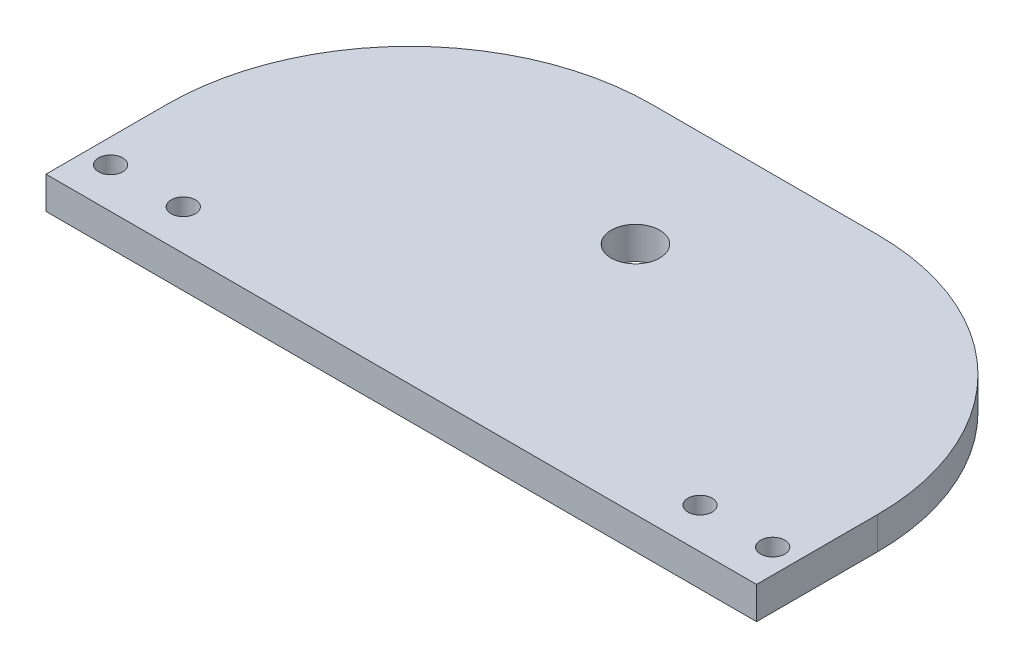
ISO-10303-21;
HEADER;
FILE_DESCRIPTION(('STEP AP214'),'2;1');
FILE_NAME('part.step','',(''),(''),'','','');
FILE_SCHEMA(('AUTOMOTIVE_DESIGN { 1 0 10303 214 1 1 1 1 }'));
ENDSEC;
DATA;
#1=APPLICATION_CONTEXT('core data for automotive mechanical design processes');
#2=APPLICATION_PROTOCOL_DEFINITION('international standard','automotive_design',2000,#1);
#3=PRODUCT_CONTEXT('',#1,'mechanical');
#4=PRODUCT('Part','Part','',(#3));
#5=PRODUCT_RELATED_PRODUCT_CATEGORY('part','',(#4));
#6=PRODUCT_DEFINITION_FORMATION('','',#4);
#7=PRODUCT_DEFINITION_CONTEXT('part definition',#1,'design');
#8=PRODUCT_DEFINITION('design','',#6,#7);
#9=PRODUCT_DEFINITION_SHAPE('','',#8);
#10=(LENGTH_UNIT() NAMED_UNIT(*) SI_UNIT(.MILLI.,.METRE.));
#11=(NAMED_UNIT(*) PLANE_ANGLE_UNIT() SI_UNIT($,.RADIAN.));
#12=(NAMED_UNIT(*) SI_UNIT($,.STERADIAN.) SOLID_ANGLE_UNIT());
#13=UNCERTAINTY_MEASURE_WITH_UNIT(LENGTH_MEASURE(1.E-05),#10,'distance_accuracy_value','');
#14=(GEOMETRIC_REPRESENTATION_CONTEXT(3) GLOBAL_UNCERTAINTY_ASSIGNED_CONTEXT((#13)) GLOBAL_UNIT_ASSIGNED_CONTEXT((#10,
#11,#12)) REPRESENTATION_CONTEXT('',''));
#15=CARTESIAN_POINT('',(0.,0.,0.));
#16=DIRECTION('',(0.,0.,1.));
#17=DIRECTION('',(1.,0.,0.));
#18=AXIS2_PLACEMENT_3D('',#15,#16,#17);
#19=CARTESIAN_POINT('',(44.,4.,-22.5));
#20=DIRECTION('',(-1.,0.,0.));
#21=DIRECTION('',(0.,0.,1.));
#22=AXIS2_PLACEMENT_3D('',#19,#20,#21);
#23=PLANE('',#22);
#24=DIRECTION('',(0.,0.,-1.));
#25=VECTOR('',#24,1.);
#26=CARTESIAN_POINT('',(44.,0.,-22.5));
#27=LINE('',#26,#25);
#28=CARTESIAN_POINT('',(44.,0.,22.5));
#29=VERTEX_POINT('',#28);
#30=CARTESIAN_POINT('',(44.,0.,7.49999999999999));
#31=VERTEX_POINT('',#30);
#32=EDGE_CURVE('E122',#29,#31,#27,.T.);
#33=ORIENTED_EDGE('',*,*,#32,.T.);
#34=DIRECTION('',(0.,-1.,0.));
#35=VECTOR('',#34,1.);
#36=CARTESIAN_POINT('',(44.,4.,7.5));
#37=LINE('',#36,#35);
#38=CARTESIAN_POINT('',(44.,4.,7.49999999999999));
#39=VERTEX_POINT('',#38);
#40=EDGE_CURVE('E62',#31,#39,#37,.F.);
#41=ORIENTED_EDGE('',*,*,#40,.T.);
#42=DIRECTION('',(0.,0.,-1.));
#43=VECTOR('',#42,1.);
#44=CARTESIAN_POINT('',(44.,4.,-22.5));
#45=LINE('',#44,#43);
#46=CARTESIAN_POINT('',(44.,4.,22.5));
#47=VERTEX_POINT('',#46);
#48=EDGE_CURVE('E134',#47,#39,#45,.T.);
#49=ORIENTED_EDGE('',*,*,#48,.F.);
#50=DIRECTION('',(0.,-1.,0.));
#51=VECTOR('',#50,1.);
#52=CARTESIAN_POINT('',(44.,4.,22.5));
#53=LINE('',#52,#51);
#54=EDGE_CURVE('E112',#47,#29,#53,.T.);
#55=ORIENTED_EDGE('',*,*,#54,.T.);
#56=EDGE_LOOP('',(#33,#41,#49,#55));
#57=FACE_BOUND('',#56,.T.);
#58=ADVANCED_FACE('F38',(#57),#23,.F.);
#59=CARTESIAN_POINT('',(-44.,4.,-22.5));
#60=DIRECTION('',(0.,0.,1.));
#61=DIRECTION('',(1.,0.,0.));
#62=AXIS2_PLACEMENT_3D('',#59,#60,#61);
#63=PLANE('',#62);
#64=DIRECTION('',(-1.,0.,0.));
#65=VECTOR('',#64,1.);
#66=CARTESIAN_POINT('',(-44.,4.,-22.5));
#67=LINE('',#66,#65);
#68=CARTESIAN_POINT('',(14.,4.,-22.5));
#69=VERTEX_POINT('',#68);
#70=CARTESIAN_POINT('',(-14.,4.,-22.5));
#71=VERTEX_POINT('',#70);
#72=EDGE_CURVE('E101',#69,#71,#67,.T.);
#73=ORIENTED_EDGE('',*,*,#72,.F.);
#74=DIRECTION('',(0.,-1.,0.));
#75=VECTOR('',#74,1.);
#76=CARTESIAN_POINT('',(14.,4.,-22.5));
#77=LINE('',#76,#75);
#78=CARTESIAN_POINT('',(14.,0.,-22.5));
#79=VERTEX_POINT('',#78);
#80=EDGE_CURVE('E138',#69,#79,#77,.T.);
#81=ORIENTED_EDGE('',*,*,#80,.T.);
#82=DIRECTION('',(-1.,0.,0.));
#83=VECTOR('',#82,1.);
#84=CARTESIAN_POINT('',(-44.,0.,-22.5));
#85=LINE('',#84,#83);
#86=CARTESIAN_POINT('',(-14.,0.,-22.5));
#87=VERTEX_POINT('',#86);
#88=EDGE_CURVE('E125',#79,#87,#85,.T.);
#89=ORIENTED_EDGE('',*,*,#88,.T.);
#90=DIRECTION('',(0.,-1.,0.));
#91=VECTOR('',#90,1.);
#92=CARTESIAN_POINT('',(-14.,4.,-22.5));
#93=LINE('',#92,#91);
#94=EDGE_CURVE('E111',#87,#71,#93,.F.);
#95=ORIENTED_EDGE('',*,*,#94,.T.);
#96=EDGE_LOOP('',(#73,#81,#89,#95));
#97=FACE_BOUND('',#96,.T.);
#98=ADVANCED_FACE('F157',(#97),#63,.F.);
#99=CARTESIAN_POINT('',(-44.,4.,-22.5));
#100=DIRECTION('',(1.,0.,0.));
#101=DIRECTION('',(0.,0.,-1.));
#102=AXIS2_PLACEMENT_3D('',#99,#100,#101);
#103=PLANE('',#102);
#104=DIRECTION('',(0.,0.,1.));
#105=VECTOR('',#104,1.);
#106=CARTESIAN_POINT('',(-44.,4.,-22.5));
#107=LINE('',#106,#105);
#108=CARTESIAN_POINT('',(-44.,4.,7.49999999999999));
#109=VERTEX_POINT('',#108);
#110=CARTESIAN_POINT('',(-44.,4.,22.5));
#111=VERTEX_POINT('',#110);
#112=EDGE_CURVE('E92',#109,#111,#107,.T.);
#113=ORIENTED_EDGE('',*,*,#112,.F.);
#114=DIRECTION('',(0.,-1.,0.));
#115=VECTOR('',#114,1.);
#116=CARTESIAN_POINT('',(-44.,4.,7.5));
#117=LINE('',#116,#115);
#118=CARTESIAN_POINT('',(-44.,0.,7.49999999999999));
#119=VERTEX_POINT('',#118);
#120=EDGE_CURVE('E11',#109,#119,#117,.T.);
#121=ORIENTED_EDGE('',*,*,#120,.T.);
#122=DIRECTION('',(0.,0.,1.));
#123=VECTOR('',#122,1.);
#124=CARTESIAN_POINT('',(-44.,0.,-22.5));
#125=LINE('',#124,#123);
#126=CARTESIAN_POINT('',(-44.,0.,22.5));
#127=VERTEX_POINT('',#126);
#128=EDGE_CURVE('E107',#119,#127,#125,.T.);
#129=ORIENTED_EDGE('',*,*,#128,.T.);
#130=DIRECTION('',(0.,-1.,0.));
#131=VECTOR('',#130,1.);
#132=CARTESIAN_POINT('',(-44.,4.,22.5));
#133=LINE('',#132,#131);
#134=EDGE_CURVE('E104',#111,#127,#133,.T.);
#135=ORIENTED_EDGE('',*,*,#134,.F.);
#136=EDGE_LOOP('',(#113,#121,#129,#135));
#137=FACE_BOUND('',#136,.T.);
#138=ADVANCED_FACE('F105',(#137),#103,.F.);
#139=CARTESIAN_POINT('',(-44.,4.,22.5));
#140=DIRECTION('',(0.,0.,-1.));
#141=DIRECTION('',(-1.,0.,0.));
#142=AXIS2_PLACEMENT_3D('',#139,#140,#141);
#143=PLANE('',#142);
#144=DIRECTION('',(1.,0.,0.));
#145=VECTOR('',#144,1.);
#146=CARTESIAN_POINT('',(-44.,0.,22.5));
#147=LINE('',#146,#145);
#148=EDGE_CURVE('E132',#127,#29,#147,.T.);
#149=ORIENTED_EDGE('',*,*,#148,.T.);
#150=ORIENTED_EDGE('',*,*,#54,.F.);
#151=DIRECTION('',(1.,0.,0.));
#152=VECTOR('',#151,1.);
#153=CARTESIAN_POINT('',(-44.,4.,22.5));
#154=LINE('',#153,#152);
#155=EDGE_CURVE('E96',#111,#47,#154,.T.);
#156=ORIENTED_EDGE('',*,*,#155,.F.);
#157=ORIENTED_EDGE('',*,*,#134,.T.);
#158=EDGE_LOOP('',(#149,#150,#156,#157));
#159=FACE_BOUND('',#158,.T.);
#160=ADVANCED_FACE('F114',(#159),#143,.F.);
#161=CARTESIAN_POINT('',(0.,4.,0.));
#162=DIRECTION('',(0.,1.,0.));
#163=DIRECTION('',(0.,0.,1.));
#164=AXIS2_PLACEMENT_3D('',#161,#162,#163);
#165=PLANE('',#164);
#166=CARTESIAN_POINT('',(-41.,4.,17.5));
#167=DIRECTION('',(0.,1.,0.));
#168=DIRECTION('',(0.,0.,1.));
#169=AXIS2_PLACEMENT_3D('',#166,#167,#168);
#170=CIRCLE('',#169,1.5);
#171=CARTESIAN_POINT('',(-41.,4.,19.));
#172=VERTEX_POINT('',#171);
#173=EDGE_CURVE('E200',#172,#172,#170,.T.);
#174=ORIENTED_EDGE('',*,*,#173,.F.);
#175=EDGE_LOOP('',(#174));
#176=FACE_BOUND('',#175,.T.);
#177=CARTESIAN_POINT('',(-32.,4.,17.5));
#178=DIRECTION('',(0.,1.,0.));
#179=DIRECTION('',(0.,0.,-1.));
#180=AXIS2_PLACEMENT_3D('',#177,#178,#179);
#181=CIRCLE('',#180,1.5);
#182=CARTESIAN_POINT('',(-32.,4.,16.));
#183=VERTEX_POINT('',#182);
#184=EDGE_CURVE('E192',#183,#183,#181,.T.);
#185=ORIENTED_EDGE('',*,*,#184,.F.);
#186=EDGE_LOOP('',(#185));
#187=FACE_BOUND('',#186,.T.);
#188=CARTESIAN_POINT('',(32.,4.,17.5));
#189=DIRECTION('',(0.,1.,0.));
#190=DIRECTION('',(0.,0.,1.));
#191=AXIS2_PLACEMENT_3D('',#188,#189,#190);
#192=CIRCLE('',#191,1.5);
#193=CARTESIAN_POINT('',(32.,4.,19.));
#194=VERTEX_POINT('',#193);
#195=EDGE_CURVE('E184',#194,#194,#192,.T.);
#196=ORIENTED_EDGE('',*,*,#195,.F.);
#197=EDGE_LOOP('',(#196));
#198=FACE_BOUND('',#197,.T.);
#199=CARTESIAN_POINT('',(41.,4.,17.5));
#200=DIRECTION('',(0.,1.,0.));
#201=DIRECTION('',(0.,0.,-1.));
#202=AXIS2_PLACEMENT_3D('',#199,#200,#201);
#203=CIRCLE('',#202,1.5);
#204=CARTESIAN_POINT('',(41.,4.,16.));
#205=VERTEX_POINT('',#204);
#206=EDGE_CURVE('E176',#205,#205,#203,.T.);
#207=ORIENTED_EDGE('',*,*,#206,.F.);
#208=EDGE_LOOP('',(#207));
#209=FACE_BOUND('',#208,.T.);
#210=CARTESIAN_POINT('',(0.,4.,-6.5));
#211=DIRECTION('',(0.,1.,0.));
#212=DIRECTION('',(0.,0.,1.));
#213=AXIS2_PLACEMENT_3D('',#210,#211,#212);
#214=CIRCLE('',#213,3.);
#215=CARTESIAN_POINT('',(0.,4.,-3.5));
#216=VERTEX_POINT('',#215);
#217=EDGE_CURVE('E168',#216,#216,#214,.T.);
#218=ORIENTED_EDGE('',*,*,#217,.F.);
#219=EDGE_LOOP('',(#218));
#220=FACE_BOUND('',#219,.T.);
#221=ORIENTED_EDGE('',*,*,#48,.T.);
#222=CARTESIAN_POINT('',(14.,4.,7.5));
#223=DIRECTION('',(0.,1.,0.));
#224=DIRECTION('',(0.,0.,1.));
#225=AXIS2_PLACEMENT_3D('',#222,#223,#224);
#226=CIRCLE('',#225,30.);
#227=EDGE_CURVE('E47',#39,#69,#226,.T.);
#228=ORIENTED_EDGE('',*,*,#227,.T.);
#229=ORIENTED_EDGE('',*,*,#72,.T.);
#230=CARTESIAN_POINT('',(-14.,4.,7.5));
#231=DIRECTION('',(0.,1.,0.));
#232=DIRECTION('',(0.,0.,1.));
#233=AXIS2_PLACEMENT_3D('',#230,#231,#232);
#234=CIRCLE('',#233,30.);
#235=EDGE_CURVE('E54',#71,#109,#234,.T.);
#236=ORIENTED_EDGE('',*,*,#235,.T.);
#237=ORIENTED_EDGE('',*,*,#112,.T.);
#238=ORIENTED_EDGE('',*,*,#155,.T.);
#239=EDGE_LOOP('',(#221,#228,#229,#236,#237,#238));
#240=FACE_BOUND('',#239,.T.);
#241=ADVANCED_FACE('F94',(#176,#187,#198,#209,#220,#240),#165,.T.);
#242=CARTESIAN_POINT('',(0.,0.,0.));
#243=DIRECTION('',(0.,1.,0.));
#244=DIRECTION('',(0.,0.,1.));
#245=AXIS2_PLACEMENT_3D('',#242,#243,#244);
#246=PLANE('',#245);
#247=CARTESIAN_POINT('',(-41.,0.,17.5));
#248=DIRECTION('',(0.,1.,0.));
#249=DIRECTION('',(0.,0.,1.));
#250=AXIS2_PLACEMENT_3D('',#247,#248,#249);
#251=CIRCLE('',#250,1.5);
#252=CARTESIAN_POINT('',(-41.,0.,19.));
#253=VERTEX_POINT('',#252);
#254=EDGE_CURVE('E172',#253,#253,#251,.T.);
#255=ORIENTED_EDGE('',*,*,#254,.T.);
#256=EDGE_LOOP('',(#255));
#257=FACE_BOUND('',#256,.T.);
#258=CARTESIAN_POINT('',(-32.,0.,17.5));
#259=DIRECTION('',(0.,1.,0.));
#260=DIRECTION('',(0.,0.,-1.));
#261=AXIS2_PLACEMENT_3D('',#258,#259,#260);
#262=CIRCLE('',#261,1.5);
#263=CARTESIAN_POINT('',(-32.,0.,16.));
#264=VERTEX_POINT('',#263);
#265=EDGE_CURVE('E196',#264,#264,#262,.T.);
#266=ORIENTED_EDGE('',*,*,#265,.T.);
#267=EDGE_LOOP('',(#266));
#268=FACE_BOUND('',#267,.T.);
#269=CARTESIAN_POINT('',(32.,0.,17.5));
#270=DIRECTION('',(0.,1.,0.));
#271=DIRECTION('',(0.,0.,1.));
#272=AXIS2_PLACEMENT_3D('',#269,#270,#271);
#273=CIRCLE('',#272,1.5);
#274=CARTESIAN_POINT('',(32.,0.,19.));
#275=VERTEX_POINT('',#274);
#276=EDGE_CURVE('E188',#275,#275,#273,.T.);
#277=ORIENTED_EDGE('',*,*,#276,.T.);
#278=EDGE_LOOP('',(#277));
#279=FACE_BOUND('',#278,.T.);
#280=CARTESIAN_POINT('',(41.,0.,17.5));
#281=DIRECTION('',(0.,1.,0.));
#282=DIRECTION('',(0.,0.,-1.));
#283=AXIS2_PLACEMENT_3D('',#280,#281,#282);
#284=CIRCLE('',#283,1.5);
#285=CARTESIAN_POINT('',(41.,0.,16.));
#286=VERTEX_POINT('',#285);
#287=EDGE_CURVE('E180',#286,#286,#284,.T.);
#288=ORIENTED_EDGE('',*,*,#287,.T.);
#289=EDGE_LOOP('',(#288));
#290=FACE_BOUND('',#289,.T.);
#291=CARTESIAN_POINT('',(0.,0.,-6.5));
#292=DIRECTION('',(0.,1.,0.));
#293=DIRECTION('',(0.,0.,1.));
#294=AXIS2_PLACEMENT_3D('',#291,#292,#293);
#295=CIRCLE('',#294,3.);
#296=CARTESIAN_POINT('',(0.,0.,-3.5));
#297=VERTEX_POINT('',#296);
#298=EDGE_CURVE('E126',#297,#297,#295,.T.);
#299=ORIENTED_EDGE('',*,*,#298,.T.);
#300=EDGE_LOOP('',(#299));
#301=FACE_BOUND('',#300,.T.);
#302=ORIENTED_EDGE('',*,*,#88,.F.);
#303=CARTESIAN_POINT('',(14.,0.,7.5));
#304=DIRECTION('',(0.,1.,0.));
#305=DIRECTION('',(0.,0.,1.));
#306=AXIS2_PLACEMENT_3D('',#303,#304,#305);
#307=CIRCLE('',#306,30.);
#308=EDGE_CURVE('E145',#79,#31,#307,.F.);
#309=ORIENTED_EDGE('',*,*,#308,.T.);
#310=ORIENTED_EDGE('',*,*,#32,.F.);
#311=ORIENTED_EDGE('',*,*,#148,.F.);
#312=ORIENTED_EDGE('',*,*,#128,.F.);
#313=CARTESIAN_POINT('',(-14.,0.,7.5));
#314=DIRECTION('',(0.,1.,0.));
#315=DIRECTION('',(0.,0.,1.));
#316=AXIS2_PLACEMENT_3D('',#313,#314,#315);
#317=CIRCLE('',#316,30.);
#318=EDGE_CURVE('E142',#119,#87,#317,.F.);
#319=ORIENTED_EDGE('',*,*,#318,.T.);
#320=EDGE_LOOP('',(#302,#309,#310,#311,#312,#319));
#321=FACE_BOUND('',#320,.T.);
#322=ADVANCED_FACE('F164',(#257,#268,#279,#290,#301,#321),#246,.F.);
#323=CARTESIAN_POINT('',(0.,0.,-6.5));
#324=DIRECTION('',(0.,1.,0.));
#325=DIRECTION('',(0.,0.,1.));
#326=AXIS2_PLACEMENT_3D('',#323,#324,#325);
#327=CYLINDRICAL_SURFACE('',#326,3.);
#328=ORIENTED_EDGE('',*,*,#298,.F.);
#329=EDGE_LOOP('',(#328));
#330=FACE_BOUND('',#329,.T.);
#331=ORIENTED_EDGE('',*,*,#217,.T.);
#332=EDGE_LOOP('',(#331));
#333=FACE_BOUND('',#332,.T.);
#334=ADVANCED_FACE('F228',(#330,#333),#327,.F.);
#335=CARTESIAN_POINT('',(41.,0.,17.5));
#336=DIRECTION('',(0.,1.,0.));
#337=DIRECTION('',(0.,0.,1.));
#338=AXIS2_PLACEMENT_3D('',#335,#336,#337);
#339=CYLINDRICAL_SURFACE('',#338,1.5);
#340=ORIENTED_EDGE('',*,*,#287,.F.);
#341=EDGE_LOOP('',(#340));
#342=FACE_BOUND('',#341,.T.);
#343=ORIENTED_EDGE('',*,*,#206,.T.);
#344=EDGE_LOOP('',(#343));
#345=FACE_BOUND('',#344,.T.);
#346=ADVANCED_FACE('F230',(#342,#345),#339,.F.);
#347=CARTESIAN_POINT('',(32.,0.,17.5));
#348=DIRECTION('',(0.,1.,0.));
#349=DIRECTION('',(0.,0.,1.));
#350=AXIS2_PLACEMENT_3D('',#347,#348,#349);
#351=CYLINDRICAL_SURFACE('',#350,1.5);
#352=ORIENTED_EDGE('',*,*,#276,.F.);
#353=EDGE_LOOP('',(#352));
#354=FACE_BOUND('',#353,.T.);
#355=ORIENTED_EDGE('',*,*,#195,.T.);
#356=EDGE_LOOP('',(#355));
#357=FACE_BOUND('',#356,.T.);
#358=ADVANCED_FACE('F237',(#354,#357),#351,.F.);
#359=CARTESIAN_POINT('',(-32.,0.,17.5));
#360=DIRECTION('',(0.,1.,0.));
#361=DIRECTION('',(0.,0.,1.));
#362=AXIS2_PLACEMENT_3D('',#359,#360,#361);
#363=CYLINDRICAL_SURFACE('',#362,1.5);
#364=ORIENTED_EDGE('',*,*,#265,.F.);
#365=EDGE_LOOP('',(#364));
#366=FACE_BOUND('',#365,.T.);
#367=ORIENTED_EDGE('',*,*,#184,.T.);
#368=EDGE_LOOP('',(#367));
#369=FACE_BOUND('',#368,.T.);
#370=ADVANCED_FACE('F213',(#366,#369),#363,.F.);
#371=CARTESIAN_POINT('',(-41.,0.,17.5));
#372=DIRECTION('',(0.,1.,0.));
#373=DIRECTION('',(0.,0.,1.));
#374=AXIS2_PLACEMENT_3D('',#371,#372,#373);
#375=CYLINDRICAL_SURFACE('',#374,1.5);
#376=ORIENTED_EDGE('',*,*,#254,.F.);
#377=EDGE_LOOP('',(#376));
#378=FACE_BOUND('',#377,.T.);
#379=ORIENTED_EDGE('',*,*,#173,.T.);
#380=EDGE_LOOP('',(#379));
#381=FACE_BOUND('',#380,.T.);
#382=ADVANCED_FACE('F210',(#378,#381),#375,.F.);
#383=CARTESIAN_POINT('',(14.,4.,7.5));
#384=DIRECTION('',(0.,-1.,0.));
#385=DIRECTION('',(0.,0.,-1.));
#386=AXIS2_PLACEMENT_3D('',#383,#384,#385);
#387=CYLINDRICAL_SURFACE('',#386,30.);
#388=ORIENTED_EDGE('',*,*,#227,.F.);
#389=ORIENTED_EDGE('',*,*,#40,.F.);
#390=ORIENTED_EDGE('',*,*,#308,.F.);
#391=ORIENTED_EDGE('',*,*,#80,.F.);
#392=EDGE_LOOP('',(#388,#389,#390,#391));
#393=FACE_BOUND('',#392,.T.);
#394=ADVANCED_FACE('F161',(#393),#387,.T.);
#395=CARTESIAN_POINT('',(-14.,4.,7.5));
#396=DIRECTION('',(0.,-1.,0.));
#397=DIRECTION('',(0.,0.,-1.));
#398=AXIS2_PLACEMENT_3D('',#395,#396,#397);
#399=CYLINDRICAL_SURFACE('',#398,30.);
#400=ORIENTED_EDGE('',*,*,#235,.F.);
#401=ORIENTED_EDGE('',*,*,#94,.F.);
#402=ORIENTED_EDGE('',*,*,#318,.F.);
#403=ORIENTED_EDGE('',*,*,#120,.F.);
#404=EDGE_LOOP('',(#400,#401,#402,#403));
#405=FACE_BOUND('',#404,.T.);
#406=ADVANCED_FACE('F40',(#405),#399,.T.);
#407=CLOSED_SHELL('',(#58,#98,#138,#160,#241,#322,#334,#346,#358,#370,#382,#394,#406));
#408=MANIFOLD_SOLID_BREP('B2',#407);
#409=ADVANCED_BREP_SHAPE_REPRESENTATION('',(#18,#408),#14);
#410=SHAPE_DEFINITION_REPRESENTATION(#9,#409);
ENDSEC;
END-ISO-10303-21;
